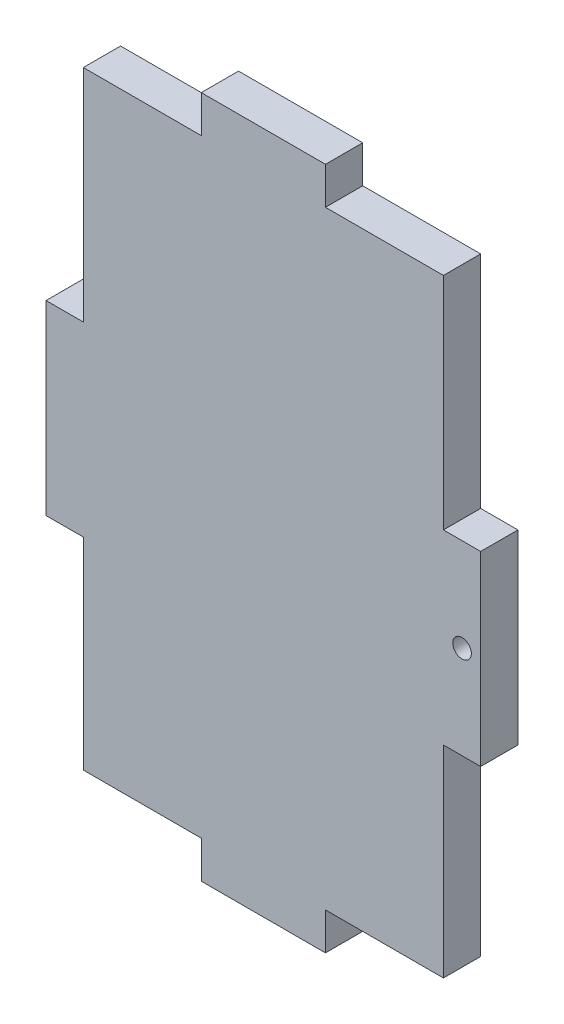
ISO-10303-21;
HEADER;
FILE_DESCRIPTION(('STEP AP214'),'2;1');
FILE_NAME('part.step','',(''),(''),'','','');
FILE_SCHEMA(('AUTOMOTIVE_DESIGN { 1 0 10303 214 1 1 1 1 }'));
ENDSEC;
DATA;
#1=APPLICATION_CONTEXT('core data for automotive mechanical design processes');
#2=APPLICATION_PROTOCOL_DEFINITION('international standard','automotive_design',2000,#1);
#3=PRODUCT_CONTEXT('',#1,'mechanical');
#4=PRODUCT('Part','Part','',(#3));
#5=PRODUCT_RELATED_PRODUCT_CATEGORY('part','',(#4));
#6=PRODUCT_DEFINITION_FORMATION('','',#4);
#7=PRODUCT_DEFINITION_CONTEXT('part definition',#1,'design');
#8=PRODUCT_DEFINITION('design','',#6,#7);
#9=PRODUCT_DEFINITION_SHAPE('','',#8);
#10=(LENGTH_UNIT() NAMED_UNIT(*) SI_UNIT(.MILLI.,.METRE.));
#11=(NAMED_UNIT(*) PLANE_ANGLE_UNIT() SI_UNIT($,.RADIAN.));
#12=(NAMED_UNIT(*) SI_UNIT($,.STERADIAN.) SOLID_ANGLE_UNIT());
#13=UNCERTAINTY_MEASURE_WITH_UNIT(LENGTH_MEASURE(1.E-05),#10,'distance_accuracy_value','');
#14=(GEOMETRIC_REPRESENTATION_CONTEXT(3) GLOBAL_UNCERTAINTY_ASSIGNED_CONTEXT((#13)) GLOBAL_UNIT_ASSIGNED_CONTEXT((#10,
#11,#12)) REPRESENTATION_CONTEXT('',''));
#15=CARTESIAN_POINT('',(0.,0.,0.));
#16=DIRECTION('',(0.,0.,1.));
#17=DIRECTION('',(1.,0.,0.));
#18=AXIS2_PLACEMENT_3D('',#15,#16,#17);
#19=CARTESIAN_POINT('',(-3.,53.5,6.));
#20=DIRECTION('',(0.,0.,-1.));
#21=DIRECTION('',(-1.,0.,0.));
#22=AXIS2_PLACEMENT_3D('',#19,#20,#21);
#23=CYLINDRICAL_SURFACE('',#22,1.5);
#24=CARTESIAN_POINT('',(-3.,53.5,6.));
#25=DIRECTION('',(0.,0.,-1.));
#26=DIRECTION('',(-1.,0.,0.));
#27=AXIS2_PLACEMENT_3D('',#24,#25,#26);
#28=CIRCLE('',#27,1.5);
#29=CARTESIAN_POINT('',(-4.5,53.5,6.));
#30=VERTEX_POINT('',#29);
#31=EDGE_CURVE('E344',#30,#30,#28,.T.);
#32=ORIENTED_EDGE('',*,*,#31,.F.);
#33=EDGE_LOOP('',(#32));
#34=FACE_BOUND('',#33,.T.);
#35=CARTESIAN_POINT('',(-3.,53.5,3.));
#36=DIRECTION('',(0.,0.,-1.));
#37=DIRECTION('',(-1.,0.,0.));
#38=AXIS2_PLACEMENT_3D('',#35,#36,#37);
#39=CIRCLE('',#38,1.5);
#40=CARTESIAN_POINT('',(-4.5,53.5,3.));
#41=VERTEX_POINT('',#40);
#42=EDGE_CURVE('E38',#41,#41,#39,.F.);
#43=ORIENTED_EDGE('',*,*,#42,.F.);
#44=EDGE_LOOP('',(#43));
#45=FACE_BOUND('',#44,.T.);
#46=ADVANCED_FACE('F34',(#34,#45),#23,.F.);
#47=CARTESIAN_POINT('',(0.,0.,6.));
#48=DIRECTION('',(-1.,0.,0.));
#49=DIRECTION('',(0.,0.,1.));
#50=AXIS2_PLACEMENT_3D('',#47,#48,#49);
#51=PLANE('',#50);
#52=DIRECTION('',(0.,1.,0.));
#53=VECTOR('',#52,1.);
#54=CARTESIAN_POINT('',(0.,0.,6.));
#55=LINE('',#54,#53);
#56=CARTESIAN_POINT('',(0.,38.5,6.));
#57=VERTEX_POINT('',#56);
#58=CARTESIAN_POINT('',(0.,68.5,6.));
#59=VERTEX_POINT('',#58);
#60=EDGE_CURVE('E297',#57,#59,#55,.T.);
#61=ORIENTED_EDGE('',*,*,#60,.F.);
#62=DIRECTION('',(0.,0.,-1.));
#63=VECTOR('',#62,1.);
#64=CARTESIAN_POINT('',(0.,38.5,6.));
#65=LINE('',#64,#63);
#66=CARTESIAN_POINT('',(0.,38.5,0.));
#67=VERTEX_POINT('',#66);
#68=EDGE_CURVE('E211',#57,#67,#65,.T.);
#69=ORIENTED_EDGE('',*,*,#68,.T.);
#70=DIRECTION('',(0.,1.,0.));
#71=VECTOR('',#70,1.);
#72=CARTESIAN_POINT('',(0.,0.,0.));
#73=LINE('',#72,#71);
#74=CARTESIAN_POINT('',(0.,68.5,0.));
#75=VERTEX_POINT('',#74);
#76=EDGE_CURVE('E288',#67,#75,#73,.T.);
#77=ORIENTED_EDGE('',*,*,#76,.T.);
#78=DIRECTION('',(0.,0.,-1.));
#79=VECTOR('',#78,1.);
#80=CARTESIAN_POINT('',(0.,68.5,6.));
#81=LINE('',#80,#79);
#82=EDGE_CURVE('E275',#59,#75,#81,.T.);
#83=ORIENTED_EDGE('',*,*,#82,.F.);
#84=EDGE_LOOP('',(#61,#69,#77,#83));
#85=FACE_BOUND('',#84,.T.);
#86=ADVANCED_FACE('F36',(#85),#51,.F.);
#87=CARTESIAN_POINT('',(0.,110.,6.));
#88=DIRECTION('',(0.,-1.,0.));
#89=DIRECTION('',(1.,0.,0.));
#90=AXIS2_PLACEMENT_3D('',#87,#88,#89);
#91=PLANE('',#90);
#92=DIRECTION('',(-1.,0.,0.));
#93=VECTOR('',#92,1.);
#94=CARTESIAN_POINT('',(0.,110.,0.));
#95=LINE('',#94,#93);
#96=CARTESIAN_POINT('',(-25.,110.,0.));
#97=VERTEX_POINT('',#96);
#98=CARTESIAN_POINT('',(-45.,110.,0.));
#99=VERTEX_POINT('',#98);
#100=EDGE_CURVE('E305',#97,#99,#95,.T.);
#101=ORIENTED_EDGE('',*,*,#100,.T.);
#102=DIRECTION('',(0.,0.,-1.));
#103=VECTOR('',#102,1.);
#104=CARTESIAN_POINT('',(-45.,110.,6.));
#105=LINE('',#104,#103);
#106=CARTESIAN_POINT('',(-45.,110.,6.));
#107=VERTEX_POINT('',#106);
#108=EDGE_CURVE('E241',#107,#99,#105,.T.);
#109=ORIENTED_EDGE('',*,*,#108,.F.);
#110=DIRECTION('',(-1.,0.,0.));
#111=VECTOR('',#110,1.);
#112=CARTESIAN_POINT('',(0.,110.,6.));
#113=LINE('',#112,#111);
#114=CARTESIAN_POINT('',(-25.,110.,6.));
#115=VERTEX_POINT('',#114);
#116=EDGE_CURVE('E299',#115,#107,#113,.T.);
#117=ORIENTED_EDGE('',*,*,#116,.F.);
#118=DIRECTION('',(0.,0.,-1.));
#119=VECTOR('',#118,1.);
#120=CARTESIAN_POINT('',(-25.,110.,6.));
#121=LINE('',#120,#119);
#122=EDGE_CURVE('E285',#115,#97,#121,.T.);
#123=ORIENTED_EDGE('',*,*,#122,.T.);
#124=EDGE_LOOP('',(#101,#109,#117,#123));
#125=FACE_BOUND('',#124,.T.);
#126=ADVANCED_FACE('F370',(#125),#91,.F.);
#127=CARTESIAN_POINT('',(-70.,0.,6.));
#128=DIRECTION('',(1.,0.,0.));
#129=DIRECTION('',(0.,0.,-1.));
#130=AXIS2_PLACEMENT_3D('',#127,#128,#129);
#131=PLANE('',#130);
#132=DIRECTION('',(0.,-1.,0.));
#133=VECTOR('',#132,1.);
#134=CARTESIAN_POINT('',(-70.,0.,0.));
#135=LINE('',#134,#133);
#136=CARTESIAN_POINT('',(-70.,68.5,0.));
#137=VERTEX_POINT('',#136);
#138=CARTESIAN_POINT('',(-70.,38.5,0.));
#139=VERTEX_POINT('',#138);
#140=EDGE_CURVE('E308',#137,#139,#135,.T.);
#141=ORIENTED_EDGE('',*,*,#140,.T.);
#142=DIRECTION('',(0.,0.,-1.));
#143=VECTOR('',#142,1.);
#144=CARTESIAN_POINT('',(-70.,38.5,6.));
#145=LINE('',#144,#143);
#146=CARTESIAN_POINT('',(-70.,38.5,6.));
#147=VERTEX_POINT('',#146);
#148=EDGE_CURVE('E59',#147,#139,#145,.T.);
#149=ORIENTED_EDGE('',*,*,#148,.F.);
#150=DIRECTION('',(0.,-1.,0.));
#151=VECTOR('',#150,1.);
#152=CARTESIAN_POINT('',(-70.,0.,6.));
#153=LINE('',#152,#151);
#154=CARTESIAN_POINT('',(-70.,68.5,6.));
#155=VERTEX_POINT('',#154);
#156=EDGE_CURVE('E43',#155,#147,#153,.T.);
#157=ORIENTED_EDGE('',*,*,#156,.F.);
#158=DIRECTION('',(0.,0.,-1.));
#159=VECTOR('',#158,1.);
#160=CARTESIAN_POINT('',(-70.,68.5,6.));
#161=LINE('',#160,#159);
#162=EDGE_CURVE('E251',#155,#137,#161,.T.);
#163=ORIENTED_EDGE('',*,*,#162,.T.);
#164=EDGE_LOOP('',(#141,#149,#157,#163));
#165=FACE_BOUND('',#164,.T.);
#166=ADVANCED_FACE('F312',(#165),#131,.F.);
#167=CARTESIAN_POINT('',(0.,0.,6.));
#168=DIRECTION('',(0.,1.,0.));
#169=DIRECTION('',(-1.,0.,0.));
#170=AXIS2_PLACEMENT_3D('',#167,#168,#169);
#171=PLANE('',#170);
#172=DIRECTION('',(1.,0.,0.));
#173=VECTOR('',#172,1.);
#174=CARTESIAN_POINT('',(0.,0.,0.));
#175=LINE('',#174,#173);
#176=CARTESIAN_POINT('',(-45.,0.,0.));
#177=VERTEX_POINT('',#176);
#178=CARTESIAN_POINT('',(-25.,0.,0.));
#179=VERTEX_POINT('',#178);
#180=EDGE_CURVE('E188',#177,#179,#175,.T.);
#181=ORIENTED_EDGE('',*,*,#180,.T.);
#182=DIRECTION('',(0.,0.,-1.));
#183=VECTOR('',#182,1.);
#184=CARTESIAN_POINT('',(-25.,0.,6.));
#185=LINE('',#184,#183);
#186=CARTESIAN_POINT('',(-25.,0.,6.));
#187=VERTEX_POINT('',#186);
#188=EDGE_CURVE('E51',#187,#179,#185,.T.);
#189=ORIENTED_EDGE('',*,*,#188,.F.);
#190=DIRECTION('',(1.,0.,0.));
#191=VECTOR('',#190,1.);
#192=CARTESIAN_POINT('',(0.,0.,6.));
#193=LINE('',#192,#191);
#194=CARTESIAN_POINT('',(-45.,0.,6.));
#195=VERTEX_POINT('',#194);
#196=EDGE_CURVE('E11',#195,#187,#193,.T.);
#197=ORIENTED_EDGE('',*,*,#196,.F.);
#198=DIRECTION('',(0.,0.,-1.));
#199=VECTOR('',#198,1.);
#200=CARTESIAN_POINT('',(-45.,0.,6.));
#201=LINE('',#200,#199);
#202=EDGE_CURVE('E220',#195,#177,#201,.T.);
#203=ORIENTED_EDGE('',*,*,#202,.T.);
#204=EDGE_LOOP('',(#181,#189,#197,#203));
#205=FACE_BOUND('',#204,.T.);
#206=ADVANCED_FACE('F185',(#205),#171,.F.);
#207=CARTESIAN_POINT('',(0.,0.,6.));
#208=DIRECTION('',(0.,0.,1.));
#209=DIRECTION('',(1.,0.,0.));
#210=AXIS2_PLACEMENT_3D('',#207,#208,#209);
#211=PLANE('',#210);
#212=ORIENTED_EDGE('',*,*,#31,.T.);
#213=EDGE_LOOP('',(#212));
#214=FACE_BOUND('',#213,.T.);
#215=DIRECTION('',(1.,0.,0.));
#216=VECTOR('',#215,1.);
#217=CARTESIAN_POINT('',(0.,38.5,6.));
#218=LINE('',#217,#216);
#219=CARTESIAN_POINT('',(-6.,38.5,6.));
#220=VERTEX_POINT('',#219);
#221=EDGE_CURVE('E189',#220,#57,#218,.T.);
#222=ORIENTED_EDGE('',*,*,#221,.T.);
#223=ORIENTED_EDGE('',*,*,#60,.T.);
#224=DIRECTION('',(-1.,0.,0.));
#225=VECTOR('',#224,1.);
#226=CARTESIAN_POINT('',(0.,68.5,6.));
#227=LINE('',#226,#225);
#228=CARTESIAN_POINT('',(-6.00000000000001,68.5,6.));
#229=VERTEX_POINT('',#228);
#230=EDGE_CURVE('E262',#59,#229,#227,.T.);
#231=ORIENTED_EDGE('',*,*,#230,.T.);
#232=DIRECTION('',(0.,1.,0.));
#233=VECTOR('',#232,1.);
#234=CARTESIAN_POINT('',(-6.,104.,6.));
#235=LINE('',#234,#233);
#236=CARTESIAN_POINT('',(-6.,104.,6.));
#237=VERTEX_POINT('',#236);
#238=EDGE_CURVE('E265',#229,#237,#235,.T.);
#239=ORIENTED_EDGE('',*,*,#238,.T.);
#240=DIRECTION('',(-1.,0.,0.));
#241=VECTOR('',#240,1.);
#242=CARTESIAN_POINT('',(-6.,104.,6.));
#243=LINE('',#242,#241);
#244=CARTESIAN_POINT('',(-25.,104.,6.));
#245=VERTEX_POINT('',#244);
#246=EDGE_CURVE('E269',#237,#245,#243,.T.);
#247=ORIENTED_EDGE('',*,*,#246,.T.);
#248=DIRECTION('',(0.,1.,0.));
#249=VECTOR('',#248,1.);
#250=CARTESIAN_POINT('',(-25.,110.,6.));
#251=LINE('',#250,#249);
#252=EDGE_CURVE('E272',#245,#115,#251,.T.);
#253=ORIENTED_EDGE('',*,*,#252,.T.);
#254=ORIENTED_EDGE('',*,*,#116,.T.);
#255=DIRECTION('',(0.,-1.,0.));
#256=VECTOR('',#255,1.);
#257=CARTESIAN_POINT('',(-45.,110.,6.));
#258=LINE('',#257,#256);
#259=CARTESIAN_POINT('',(-45.,104.,6.));
#260=VERTEX_POINT('',#259);
#261=EDGE_CURVE('E228',#107,#260,#258,.T.);
#262=ORIENTED_EDGE('',*,*,#261,.T.);
#263=DIRECTION('',(-1.,0.,0.));
#264=VECTOR('',#263,1.);
#265=CARTESIAN_POINT('',(-64.,104.,6.));
#266=LINE('',#265,#264);
#267=CARTESIAN_POINT('',(-64.,104.,6.));
#268=VERTEX_POINT('',#267);
#269=EDGE_CURVE('E231',#260,#268,#266,.T.);
#270=ORIENTED_EDGE('',*,*,#269,.T.);
#271=DIRECTION('',(0.,-1.,0.));
#272=VECTOR('',#271,1.);
#273=CARTESIAN_POINT('',(-64.,104.,6.));
#274=LINE('',#273,#272);
#275=CARTESIAN_POINT('',(-64.,68.5,6.));
#276=VERTEX_POINT('',#275);
#277=EDGE_CURVE('E235',#268,#276,#274,.T.);
#278=ORIENTED_EDGE('',*,*,#277,.T.);
#279=DIRECTION('',(-1.,0.,0.));
#280=VECTOR('',#279,1.);
#281=CARTESIAN_POINT('',(-70.,68.5,6.));
#282=LINE('',#281,#280);
#283=EDGE_CURVE('E238',#276,#155,#282,.T.);
#284=ORIENTED_EDGE('',*,*,#283,.T.);
#285=ORIENTED_EDGE('',*,*,#156,.T.);
#286=DIRECTION('',(1.,0.,0.));
#287=VECTOR('',#286,1.);
#288=CARTESIAN_POINT('',(-70.,38.5,6.));
#289=LINE('',#288,#287);
#290=CARTESIAN_POINT('',(-64.,38.5,6.));
#291=VERTEX_POINT('',#290);
#292=EDGE_CURVE('E219',#147,#291,#289,.T.);
#293=ORIENTED_EDGE('',*,*,#292,.T.);
#294=DIRECTION('',(0.,-1.,0.));
#295=VECTOR('',#294,1.);
#296=CARTESIAN_POINT('',(-64.,6.,6.));
#297=LINE('',#296,#295);
#298=CARTESIAN_POINT('',(-64.,6.,6.));
#299=VERTEX_POINT('',#298);
#300=EDGE_CURVE('E204',#291,#299,#297,.T.);
#301=ORIENTED_EDGE('',*,*,#300,.T.);
#302=DIRECTION('',(1.,0.,0.));
#303=VECTOR('',#302,1.);
#304=CARTESIAN_POINT('',(-64.,6.,6.));
#305=LINE('',#304,#303);
#306=CARTESIAN_POINT('',(-45.,6.,6.));
#307=VERTEX_POINT('',#306);
#308=EDGE_CURVE('E199',#299,#307,#305,.T.);
#309=ORIENTED_EDGE('',*,*,#308,.T.);
#310=DIRECTION('',(0.,-1.,0.));
#311=VECTOR('',#310,1.);
#312=CARTESIAN_POINT('',(-45.,0.,6.));
#313=LINE('',#312,#311);
#314=EDGE_CURVE('E196',#307,#195,#313,.T.);
#315=ORIENTED_EDGE('',*,*,#314,.T.);
#316=ORIENTED_EDGE('',*,*,#196,.T.);
#317=DIRECTION('',(0.,1.,0.));
#318=VECTOR('',#317,1.);
#319=CARTESIAN_POINT('',(-25.,0.,6.));
#320=LINE('',#319,#318);
#321=CARTESIAN_POINT('',(-25.,6.,6.));
#322=VERTEX_POINT('',#321);
#323=EDGE_CURVE('E173',#187,#322,#320,.T.);
#324=ORIENTED_EDGE('',*,*,#323,.T.);
#325=DIRECTION('',(1.,0.,0.));
#326=VECTOR('',#325,1.);
#327=CARTESIAN_POINT('',(-6.,6.,6.));
#328=LINE('',#327,#326);
#329=CARTESIAN_POINT('',(-6.,6.,6.));
#330=VERTEX_POINT('',#329);
#331=EDGE_CURVE('E179',#322,#330,#328,.T.);
#332=ORIENTED_EDGE('',*,*,#331,.T.);
#333=DIRECTION('',(0.,1.,0.));
#334=VECTOR('',#333,1.);
#335=CARTESIAN_POINT('',(-6.,6.,6.));
#336=LINE('',#335,#334);
#337=EDGE_CURVE('E346',#330,#220,#336,.T.);
#338=ORIENTED_EDGE('',*,*,#337,.T.);
#339=EDGE_LOOP('',(#222,#223,#231,#239,#247,#253,#254,#262,#270,#278,#284,#285,#293,#301,#309,
#315,#316,#324,#332,#338));
#340=FACE_BOUND('',#339,.T.);
#341=ADVANCED_FACE('F193',(#214,#340),#211,.T.);
#342=CARTESIAN_POINT('',(0.,0.,0.));
#343=DIRECTION('',(0.,0.,1.));
#344=DIRECTION('',(1.,0.,0.));
#345=AXIS2_PLACEMENT_3D('',#342,#343,#344);
#346=PLANE('',#345);
#347=CARTESIAN_POINT('',(-3.,53.5,0.));
#348=DIRECTION('',(0.,0.,-1.));
#349=DIRECTION('',(-1.,0.,0.));
#350=AXIS2_PLACEMENT_3D('',#347,#348,#349);
#351=CIRCLE('',#350,2.995);
#352=CARTESIAN_POINT('',(-5.995,53.5,0.));
#353=VERTEX_POINT('',#352);
#354=EDGE_CURVE('E352',#353,#353,#351,.T.);
#355=ORIENTED_EDGE('',*,*,#354,.F.);
#356=EDGE_LOOP('',(#355));
#357=FACE_BOUND('',#356,.T.);
#358=ORIENTED_EDGE('',*,*,#76,.F.);
#359=DIRECTION('',(1.,0.,0.));
#360=VECTOR('',#359,1.);
#361=CARTESIAN_POINT('',(0.,38.5,0.));
#362=LINE('',#361,#360);
#363=CARTESIAN_POINT('',(-6.,38.5,0.));
#364=VERTEX_POINT('',#363);
#365=EDGE_CURVE('E180',#364,#67,#362,.T.);
#366=ORIENTED_EDGE('',*,*,#365,.F.);
#367=DIRECTION('',(0.,1.,0.));
#368=VECTOR('',#367,1.);
#369=CARTESIAN_POINT('',(-6.,6.,0.));
#370=LINE('',#369,#368);
#371=CARTESIAN_POINT('',(-6.,6.,0.));
#372=VERTEX_POINT('',#371);
#373=EDGE_CURVE('E336',#372,#364,#370,.T.);
#374=ORIENTED_EDGE('',*,*,#373,.F.);
#375=DIRECTION('',(1.,0.,0.));
#376=VECTOR('',#375,1.);
#377=CARTESIAN_POINT('',(-6.,6.,0.));
#378=LINE('',#377,#376);
#379=CARTESIAN_POINT('',(-25.,6.,0.));
#380=VERTEX_POINT('',#379);
#381=EDGE_CURVE('E339',#380,#372,#378,.T.);
#382=ORIENTED_EDGE('',*,*,#381,.F.);
#383=DIRECTION('',(0.,1.,0.));
#384=VECTOR('',#383,1.);
#385=CARTESIAN_POINT('',(-25.,0.,0.));
#386=LINE('',#385,#384);
#387=EDGE_CURVE('E342',#179,#380,#386,.T.);
#388=ORIENTED_EDGE('',*,*,#387,.F.);
#389=ORIENTED_EDGE('',*,*,#180,.F.);
#390=DIRECTION('',(0.,-1.,0.));
#391=VECTOR('',#390,1.);
#392=CARTESIAN_POINT('',(-45.,0.,0.));
#393=LINE('',#392,#391);
#394=CARTESIAN_POINT('',(-45.,6.,0.));
#395=VERTEX_POINT('',#394);
#396=EDGE_CURVE('E217',#395,#177,#393,.T.);
#397=ORIENTED_EDGE('',*,*,#396,.F.);
#398=DIRECTION('',(1.,0.,0.));
#399=VECTOR('',#398,1.);
#400=CARTESIAN_POINT('',(-64.,6.,0.));
#401=LINE('',#400,#399);
#402=CARTESIAN_POINT('',(-64.,6.,0.));
#403=VERTEX_POINT('',#402);
#404=EDGE_CURVE('E214',#403,#395,#401,.T.);
#405=ORIENTED_EDGE('',*,*,#404,.F.);
#406=DIRECTION('',(0.,-1.,0.));
#407=VECTOR('',#406,1.);
#408=CARTESIAN_POINT('',(-64.,6.,0.));
#409=LINE('',#408,#407);
#410=CARTESIAN_POINT('',(-64.,38.5,0.));
#411=VERTEX_POINT('',#410);
#412=EDGE_CURVE('E210',#411,#403,#409,.T.);
#413=ORIENTED_EDGE('',*,*,#412,.F.);
#414=DIRECTION('',(1.,0.,0.));
#415=VECTOR('',#414,1.);
#416=CARTESIAN_POINT('',(-70.,38.5,0.));
#417=LINE('',#416,#415);
#418=EDGE_CURVE('E208',#139,#411,#417,.T.);
#419=ORIENTED_EDGE('',*,*,#418,.F.);
#420=ORIENTED_EDGE('',*,*,#140,.F.);
#421=DIRECTION('',(-1.,0.,0.));
#422=VECTOR('',#421,1.);
#423=CARTESIAN_POINT('',(-70.,68.5,0.));
#424=LINE('',#423,#422);
#425=CARTESIAN_POINT('',(-64.,68.5,0.));
#426=VERTEX_POINT('',#425);
#427=EDGE_CURVE('E232',#426,#137,#424,.T.);
#428=ORIENTED_EDGE('',*,*,#427,.F.);
#429=DIRECTION('',(0.,-1.,0.));
#430=VECTOR('',#429,1.);
#431=CARTESIAN_POINT('',(-64.,104.,0.));
#432=LINE('',#431,#430);
#433=CARTESIAN_POINT('',(-64.,104.,0.));
#434=VERTEX_POINT('',#433);
#435=EDGE_CURVE('E247',#434,#426,#432,.T.);
#436=ORIENTED_EDGE('',*,*,#435,.F.);
#437=DIRECTION('',(-1.,0.,0.));
#438=VECTOR('',#437,1.);
#439=CARTESIAN_POINT('',(-64.,104.,0.));
#440=LINE('',#439,#438);
#441=CARTESIAN_POINT('',(-45.,104.,0.));
#442=VERTEX_POINT('',#441);
#443=EDGE_CURVE('E244',#442,#434,#440,.T.);
#444=ORIENTED_EDGE('',*,*,#443,.F.);
#445=DIRECTION('',(0.,-1.,0.));
#446=VECTOR('',#445,1.);
#447=CARTESIAN_POINT('',(-45.,110.,0.));
#448=LINE('',#447,#446);
#449=EDGE_CURVE('E222',#99,#442,#448,.T.);
#450=ORIENTED_EDGE('',*,*,#449,.F.);
#451=ORIENTED_EDGE('',*,*,#100,.F.);
#452=DIRECTION('',(0.,1.,0.));
#453=VECTOR('',#452,1.);
#454=CARTESIAN_POINT('',(-25.,110.,0.));
#455=LINE('',#454,#453);
#456=CARTESIAN_POINT('',(-25.,104.,0.));
#457=VERTEX_POINT('',#456);
#458=EDGE_CURVE('E266',#457,#97,#455,.T.);
#459=ORIENTED_EDGE('',*,*,#458,.F.);
#460=DIRECTION('',(-1.,0.,0.));
#461=VECTOR('',#460,1.);
#462=CARTESIAN_POINT('',(-6.,104.,0.));
#463=LINE('',#462,#461);
#464=CARTESIAN_POINT('',(-6.,104.,0.));
#465=VERTEX_POINT('',#464);
#466=EDGE_CURVE('E281',#465,#457,#463,.T.);
#467=ORIENTED_EDGE('',*,*,#466,.F.);
#468=DIRECTION('',(0.,1.,0.));
#469=VECTOR('',#468,1.);
#470=CARTESIAN_POINT('',(-6.,104.,0.));
#471=LINE('',#470,#469);
#472=CARTESIAN_POINT('',(-6.00000000000001,68.5,0.));
#473=VERTEX_POINT('',#472);
#474=EDGE_CURVE('E278',#473,#465,#471,.T.);
#475=ORIENTED_EDGE('',*,*,#474,.F.);
#476=DIRECTION('',(-1.,0.,0.));
#477=VECTOR('',#476,1.);
#478=CARTESIAN_POINT('',(0.,68.5,0.));
#479=LINE('',#478,#477);
#480=EDGE_CURVE('E254',#75,#473,#479,.T.);
#481=ORIENTED_EDGE('',*,*,#480,.F.);
#482=EDGE_LOOP('',(#358,#366,#374,#382,#388,#389,#397,#405,#413,#419,#420,#428,#436,#444,#450,
#451,#459,#467,#475,#481));
#483=FACE_BOUND('',#482,.T.);
#484=ADVANCED_FACE('F317',(#357,#483),#346,.F.);
#485=CARTESIAN_POINT('',(-25.,110.,6.));
#486=DIRECTION('',(-1.,0.,0.));
#487=DIRECTION('',(0.,0.,1.));
#488=AXIS2_PLACEMENT_3D('',#485,#486,#487);
#489=PLANE('',#488);
#490=ORIENTED_EDGE('',*,*,#458,.T.);
#491=ORIENTED_EDGE('',*,*,#122,.F.);
#492=ORIENTED_EDGE('',*,*,#252,.F.);
#493=DIRECTION('',(0.,0.,-1.));
#494=VECTOR('',#493,1.);
#495=CARTESIAN_POINT('',(-25.,104.,6.));
#496=LINE('',#495,#494);
#497=EDGE_CURVE('E289',#245,#457,#496,.T.);
#498=ORIENTED_EDGE('',*,*,#497,.T.);
#499=EDGE_LOOP('',(#490,#491,#492,#498));
#500=FACE_BOUND('',#499,.T.);
#501=ADVANCED_FACE('F419',(#500),#489,.F.);
#502=CARTESIAN_POINT('',(-6.,104.,6.));
#503=DIRECTION('',(0.,-1.,0.));
#504=DIRECTION('',(0.,0.,-1.));
#505=AXIS2_PLACEMENT_3D('',#502,#503,#504);
#506=PLANE('',#505);
#507=ORIENTED_EDGE('',*,*,#466,.T.);
#508=ORIENTED_EDGE('',*,*,#497,.F.);
#509=ORIENTED_EDGE('',*,*,#246,.F.);
#510=DIRECTION('',(0.,0.,-1.));
#511=VECTOR('',#510,1.);
#512=CARTESIAN_POINT('',(-6.,104.,6.));
#513=LINE('',#512,#511);
#514=EDGE_CURVE('E291',#237,#465,#513,.T.);
#515=ORIENTED_EDGE('',*,*,#514,.T.);
#516=EDGE_LOOP('',(#507,#508,#509,#515));
#517=FACE_BOUND('',#516,.T.);
#518=ADVANCED_FACE('F422',(#517),#506,.F.);
#519=CARTESIAN_POINT('',(-6.,104.,6.));
#520=DIRECTION('',(-1.,0.,0.));
#521=DIRECTION('',(0.,-1.,0.));
#522=AXIS2_PLACEMENT_3D('',#519,#520,#521);
#523=PLANE('',#522);
#524=ORIENTED_EDGE('',*,*,#474,.T.);
#525=ORIENTED_EDGE('',*,*,#514,.F.);
#526=ORIENTED_EDGE('',*,*,#238,.F.);
#527=DIRECTION('',(0.,0.,-1.));
#528=VECTOR('',#527,1.);
#529=CARTESIAN_POINT('',(-6.00000000000001,68.5,6.));
#530=LINE('',#529,#528);
#531=EDGE_CURVE('E293',#229,#473,#530,.T.);
#532=ORIENTED_EDGE('',*,*,#531,.T.);
#533=EDGE_LOOP('',(#524,#525,#526,#532));
#534=FACE_BOUND('',#533,.T.);
#535=ADVANCED_FACE('F426',(#534),#523,.F.);
#536=CARTESIAN_POINT('',(0.,68.5,6.));
#537=DIRECTION('',(0.,-1.,0.));
#538=DIRECTION('',(0.,0.,-1.));
#539=AXIS2_PLACEMENT_3D('',#536,#537,#538);
#540=PLANE('',#539);
#541=ORIENTED_EDGE('',*,*,#480,.T.);
#542=ORIENTED_EDGE('',*,*,#531,.F.);
#543=ORIENTED_EDGE('',*,*,#230,.F.);
#544=ORIENTED_EDGE('',*,*,#82,.T.);
#545=EDGE_LOOP('',(#541,#542,#543,#544));
#546=FACE_BOUND('',#545,.T.);
#547=ADVANCED_FACE('F407',(#546),#540,.F.);
#548=CARTESIAN_POINT('',(-70.,68.5,6.));
#549=DIRECTION('',(0.,-1.,0.));
#550=DIRECTION('',(0.,0.,-1.));
#551=AXIS2_PLACEMENT_3D('',#548,#549,#550);
#552=PLANE('',#551);
#553=ORIENTED_EDGE('',*,*,#427,.T.);
#554=ORIENTED_EDGE('',*,*,#162,.F.);
#555=ORIENTED_EDGE('',*,*,#283,.F.);
#556=DIRECTION('',(0.,0.,-1.));
#557=VECTOR('',#556,1.);
#558=CARTESIAN_POINT('',(-64.,68.5,6.));
#559=LINE('',#558,#557);
#560=EDGE_CURVE('E255',#276,#426,#559,.T.);
#561=ORIENTED_EDGE('',*,*,#560,.T.);
#562=EDGE_LOOP('',(#553,#554,#555,#561));
#563=FACE_BOUND('',#562,.T.);
#564=ADVANCED_FACE('F403',(#563),#552,.F.);
#565=CARTESIAN_POINT('',(-64.,104.,6.));
#566=DIRECTION('',(1.,0.,0.));
#567=DIRECTION('',(0.,0.,-1.));
#568=AXIS2_PLACEMENT_3D('',#565,#566,#567);
#569=PLANE('',#568);
#570=ORIENTED_EDGE('',*,*,#435,.T.);
#571=ORIENTED_EDGE('',*,*,#560,.F.);
#572=ORIENTED_EDGE('',*,*,#277,.F.);
#573=DIRECTION('',(0.,0.,-1.));
#574=VECTOR('',#573,1.);
#575=CARTESIAN_POINT('',(-64.,104.,6.));
#576=LINE('',#575,#574);
#577=EDGE_CURVE('E257',#268,#434,#576,.T.);
#578=ORIENTED_EDGE('',*,*,#577,.T.);
#579=EDGE_LOOP('',(#570,#571,#572,#578));
#580=FACE_BOUND('',#579,.T.);
#581=ADVANCED_FACE('F406',(#580),#569,.F.);
#582=CARTESIAN_POINT('',(-64.,104.,6.));
#583=DIRECTION('',(0.,-1.,0.));
#584=DIRECTION('',(0.,0.,-1.));
#585=AXIS2_PLACEMENT_3D('',#582,#583,#584);
#586=PLANE('',#585);
#587=ORIENTED_EDGE('',*,*,#443,.T.);
#588=ORIENTED_EDGE('',*,*,#577,.F.);
#589=ORIENTED_EDGE('',*,*,#269,.F.);
#590=DIRECTION('',(0.,0.,-1.));
#591=VECTOR('',#590,1.);
#592=CARTESIAN_POINT('',(-45.,104.,6.));
#593=LINE('',#592,#591);
#594=EDGE_CURVE('E259',#260,#442,#593,.T.);
#595=ORIENTED_EDGE('',*,*,#594,.T.);
#596=EDGE_LOOP('',(#587,#588,#589,#595));
#597=FACE_BOUND('',#596,.T.);
#598=ADVANCED_FACE('F411',(#597),#586,.F.);
#599=CARTESIAN_POINT('',(-45.,110.,6.));
#600=DIRECTION('',(1.,0.,0.));
#601=DIRECTION('',(0.,0.,-1.));
#602=AXIS2_PLACEMENT_3D('',#599,#600,#601);
#603=PLANE('',#602);
#604=ORIENTED_EDGE('',*,*,#449,.T.);
#605=ORIENTED_EDGE('',*,*,#594,.F.);
#606=ORIENTED_EDGE('',*,*,#261,.F.);
#607=ORIENTED_EDGE('',*,*,#108,.T.);
#608=EDGE_LOOP('',(#604,#605,#606,#607));
#609=FACE_BOUND('',#608,.T.);
#610=ADVANCED_FACE('F395',(#609),#603,.F.);
#611=CARTESIAN_POINT('',(-45.,0.,6.));
#612=DIRECTION('',(1.,0.,0.));
#613=DIRECTION('',(0.,0.,-1.));
#614=AXIS2_PLACEMENT_3D('',#611,#612,#613);
#615=PLANE('',#614);
#616=ORIENTED_EDGE('',*,*,#396,.T.);
#617=ORIENTED_EDGE('',*,*,#202,.F.);
#618=ORIENTED_EDGE('',*,*,#314,.F.);
#619=DIRECTION('',(0.,0.,-1.));
#620=VECTOR('',#619,1.);
#621=CARTESIAN_POINT('',(-45.,6.,6.));
#622=LINE('',#621,#620);
#623=EDGE_CURVE('E223',#307,#395,#622,.T.);
#624=ORIENTED_EDGE('',*,*,#623,.T.);
#625=EDGE_LOOP('',(#616,#617,#618,#624));
#626=FACE_BOUND('',#625,.T.);
#627=ADVANCED_FACE('F391',(#626),#615,.F.);
#628=CARTESIAN_POINT('',(-64.,6.,6.));
#629=DIRECTION('',(0.,1.,0.));
#630=DIRECTION('',(-1.,0.,0.));
#631=AXIS2_PLACEMENT_3D('',#628,#629,#630);
#632=PLANE('',#631);
#633=ORIENTED_EDGE('',*,*,#404,.T.);
#634=ORIENTED_EDGE('',*,*,#623,.F.);
#635=ORIENTED_EDGE('',*,*,#308,.F.);
#636=DIRECTION('',(0.,0.,-1.));
#637=VECTOR('',#636,1.);
#638=CARTESIAN_POINT('',(-64.,6.,6.));
#639=LINE('',#638,#637);
#640=EDGE_CURVE('E225',#299,#403,#639,.T.);
#641=ORIENTED_EDGE('',*,*,#640,.T.);
#642=EDGE_LOOP('',(#633,#634,#635,#641));
#643=FACE_BOUND('',#642,.T.);
#644=ADVANCED_FACE('F394',(#643),#632,.F.);
#645=CARTESIAN_POINT('',(-64.,6.,6.));
#646=DIRECTION('',(1.,0.,0.));
#647=DIRECTION('',(0.,1.,0.));
#648=AXIS2_PLACEMENT_3D('',#645,#646,#647);
#649=PLANE('',#648);
#650=ORIENTED_EDGE('',*,*,#412,.T.);
#651=ORIENTED_EDGE('',*,*,#640,.F.);
#652=ORIENTED_EDGE('',*,*,#300,.F.);
#653=DIRECTION('',(0.,0.,-1.));
#654=VECTOR('',#653,1.);
#655=CARTESIAN_POINT('',(-64.,38.5,6.));
#656=LINE('',#655,#654);
#657=EDGE_CURVE('E202',#291,#411,#656,.T.);
#658=ORIENTED_EDGE('',*,*,#657,.T.);
#659=EDGE_LOOP('',(#650,#651,#652,#658));
#660=FACE_BOUND('',#659,.T.);
#661=ADVANCED_FACE('F325',(#660),#649,.F.);
#662=CARTESIAN_POINT('',(-70.,38.5,6.));
#663=DIRECTION('',(0.,1.,0.));
#664=DIRECTION('',(0.,0.,1.));
#665=AXIS2_PLACEMENT_3D('',#662,#663,#664);
#666=PLANE('',#665);
#667=ORIENTED_EDGE('',*,*,#418,.T.);
#668=ORIENTED_EDGE('',*,*,#657,.F.);
#669=ORIENTED_EDGE('',*,*,#292,.F.);
#670=ORIENTED_EDGE('',*,*,#148,.T.);
#671=EDGE_LOOP('',(#667,#668,#669,#670));
#672=FACE_BOUND('',#671,.T.);
#673=ADVANCED_FACE('F321',(#672),#666,.F.);
#674=CARTESIAN_POINT('',(0.,38.5,6.));
#675=DIRECTION('',(0.,1.,0.));
#676=DIRECTION('',(0.,0.,1.));
#677=AXIS2_PLACEMENT_3D('',#674,#675,#676);
#678=PLANE('',#677);
#679=ORIENTED_EDGE('',*,*,#365,.T.);
#680=ORIENTED_EDGE('',*,*,#68,.F.);
#681=ORIENTED_EDGE('',*,*,#221,.F.);
#682=DIRECTION('',(0.,0.,-1.));
#683=VECTOR('',#682,1.);
#684=CARTESIAN_POINT('',(-6.,38.5,6.));
#685=LINE('',#684,#683);
#686=EDGE_CURVE('E331',#220,#364,#685,.T.);
#687=ORIENTED_EDGE('',*,*,#686,.T.);
#688=EDGE_LOOP('',(#679,#680,#681,#687));
#689=FACE_BOUND('',#688,.T.);
#690=ADVANCED_FACE('F377',(#689),#678,.F.);
#691=CARTESIAN_POINT('',(-6.,6.,6.));
#692=DIRECTION('',(-1.,0.,0.));
#693=DIRECTION('',(0.,0.,1.));
#694=AXIS2_PLACEMENT_3D('',#691,#692,#693);
#695=PLANE('',#694);
#696=ORIENTED_EDGE('',*,*,#373,.T.);
#697=ORIENTED_EDGE('',*,*,#686,.F.);
#698=ORIENTED_EDGE('',*,*,#337,.F.);
#699=DIRECTION('',(0.,0.,-1.));
#700=VECTOR('',#699,1.);
#701=CARTESIAN_POINT('',(-6.,6.,6.));
#702=LINE('',#701,#700);
#703=EDGE_CURVE('E329',#330,#372,#702,.T.);
#704=ORIENTED_EDGE('',*,*,#703,.T.);
#705=EDGE_LOOP('',(#696,#697,#698,#704));
#706=FACE_BOUND('',#705,.T.);
#707=ADVANCED_FACE('F380',(#706),#695,.F.);
#708=CARTESIAN_POINT('',(-6.,6.,6.));
#709=DIRECTION('',(0.,1.,0.));
#710=DIRECTION('',(0.,0.,1.));
#711=AXIS2_PLACEMENT_3D('',#708,#709,#710);
#712=PLANE('',#711);
#713=ORIENTED_EDGE('',*,*,#381,.T.);
#714=ORIENTED_EDGE('',*,*,#703,.F.);
#715=ORIENTED_EDGE('',*,*,#331,.F.);
#716=DIRECTION('',(0.,0.,-1.));
#717=VECTOR('',#716,1.);
#718=CARTESIAN_POINT('',(-25.,6.,6.));
#719=LINE('',#718,#717);
#720=EDGE_CURVE('E175',#322,#380,#719,.T.);
#721=ORIENTED_EDGE('',*,*,#720,.T.);
#722=EDGE_LOOP('',(#713,#714,#715,#721));
#723=FACE_BOUND('',#722,.T.);
#724=ADVANCED_FACE('F384',(#723),#712,.F.);
#725=CARTESIAN_POINT('',(-25.,0.,6.));
#726=DIRECTION('',(-1.,0.,0.));
#727=DIRECTION('',(0.,0.,1.));
#728=AXIS2_PLACEMENT_3D('',#725,#726,#727);
#729=PLANE('',#728);
#730=ORIENTED_EDGE('',*,*,#387,.T.);
#731=ORIENTED_EDGE('',*,*,#720,.F.);
#732=ORIENTED_EDGE('',*,*,#323,.F.);
#733=ORIENTED_EDGE('',*,*,#188,.T.);
#734=EDGE_LOOP('',(#730,#731,#732,#733));
#735=FACE_BOUND('',#734,.T.);
#736=ADVANCED_FACE('F174',(#735),#729,.F.);
#737=CARTESIAN_POINT('',(-3.,53.5,3.));
#738=DIRECTION('',(0.,0.,-1.));
#739=DIRECTION('',(-1.,0.,0.));
#740=AXIS2_PLACEMENT_3D('',#737,#738,#739);
#741=PLANE('',#740);
#742=CARTESIAN_POINT('',(-3.,53.5,3.));
#743=DIRECTION('',(0.,0.,-1.));
#744=DIRECTION('',(-1.,0.,0.));
#745=AXIS2_PLACEMENT_3D('',#742,#743,#744);
#746=CIRCLE('',#745,2.995);
#747=CARTESIAN_POINT('',(-5.995,53.5,3.));
#748=VERTEX_POINT('',#747);
#749=EDGE_CURVE('E355',#748,#748,#746,.T.);
#750=ORIENTED_EDGE('',*,*,#749,.T.);
#751=EDGE_LOOP('',(#750));
#752=FACE_BOUND('',#751,.T.);
#753=ORIENTED_EDGE('',*,*,#42,.T.);
#754=EDGE_LOOP('',(#753));
#755=FACE_BOUND('',#754,.T.);
#756=ADVANCED_FACE('F362',(#752,#755),#741,.T.);
#757=CARTESIAN_POINT('',(-3.,53.5,3.));
#758=DIRECTION('',(0.,0.,-1.));
#759=DIRECTION('',(-1.,0.,0.));
#760=AXIS2_PLACEMENT_3D('',#757,#758,#759);
#761=CYLINDRICAL_SURFACE('',#760,2.995);
#762=ORIENTED_EDGE('',*,*,#749,.F.);
#763=EDGE_LOOP('',(#762));
#764=FACE_BOUND('',#763,.T.);
#765=ORIENTED_EDGE('',*,*,#354,.T.);
#766=EDGE_LOOP('',(#765));
#767=FACE_BOUND('',#766,.T.);
#768=ADVANCED_FACE('F375',(#764,#767),#761,.F.);
#769=CLOSED_SHELL('',(#46,#86,#126,#166,#206,#341,#484,#501,#518,#535,#547,#564,#581,#598,#610,
#627,#644,#661,#673,#690,#707,#724,#736,#756,#768));
#770=MANIFOLD_SOLID_BREP('B2',#769);
#771=ADVANCED_BREP_SHAPE_REPRESENTATION('',(#18,#770),#14);
#772=SHAPE_DEFINITION_REPRESENTATION(#9,#771);
ENDSEC;
END-ISO-10303-21;
